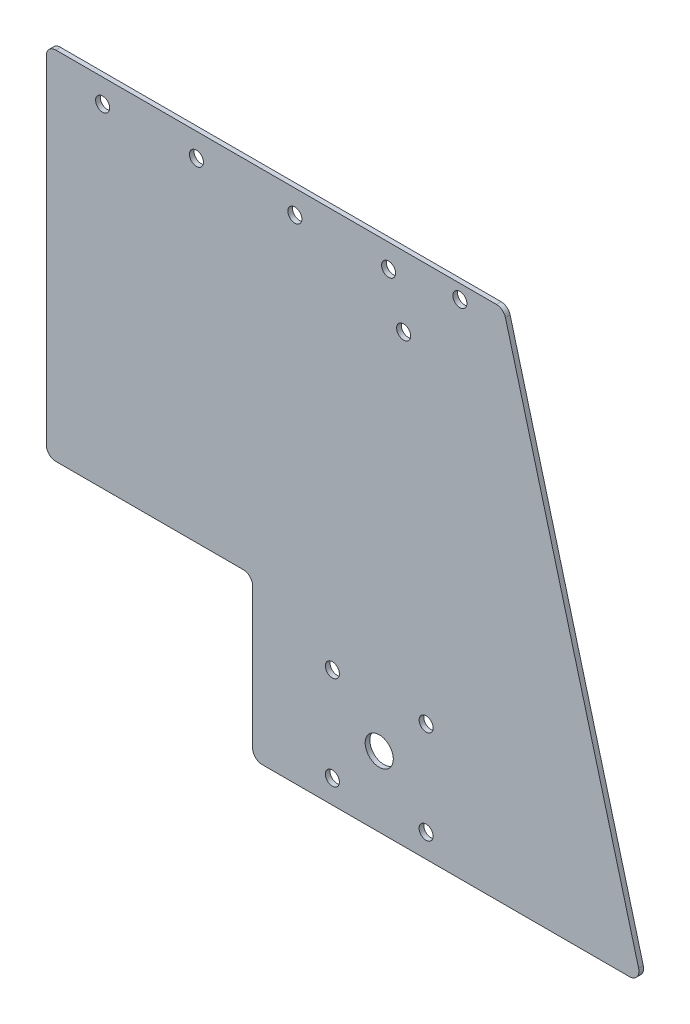
ISO-10303-21;
HEADER;
FILE_DESCRIPTION(('STEP AP214'),'2;1');
FILE_NAME('part.step','',(''),(''),'','','');
FILE_SCHEMA(('AUTOMOTIVE_DESIGN { 1 0 10303 214 1 1 1 1 }'));
ENDSEC;
DATA;
#1=APPLICATION_CONTEXT('core data for automotive mechanical design processes');
#2=APPLICATION_PROTOCOL_DEFINITION('international standard','automotive_design',2000,#1);
#3=PRODUCT_CONTEXT('',#1,'mechanical');
#4=PRODUCT('Part','Part','',(#3));
#5=PRODUCT_RELATED_PRODUCT_CATEGORY('part','',(#4));
#6=PRODUCT_DEFINITION_FORMATION('','',#4);
#7=PRODUCT_DEFINITION_CONTEXT('part definition',#1,'design');
#8=PRODUCT_DEFINITION('design','',#6,#7);
#9=PRODUCT_DEFINITION_SHAPE('','',#8);
#10=(LENGTH_UNIT() NAMED_UNIT(*) SI_UNIT(.MILLI.,.METRE.));
#11=(NAMED_UNIT(*) PLANE_ANGLE_UNIT() SI_UNIT($,.RADIAN.));
#12=(NAMED_UNIT(*) SI_UNIT($,.STERADIAN.) SOLID_ANGLE_UNIT());
#13=UNCERTAINTY_MEASURE_WITH_UNIT(LENGTH_MEASURE(1.E-05),#10,'distance_accuracy_value','');
#14=(GEOMETRIC_REPRESENTATION_CONTEXT(3) GLOBAL_UNCERTAINTY_ASSIGNED_CONTEXT((#13)) GLOBAL_UNIT_ASSIGNED_CONTEXT((#10,
#11,#12)) REPRESENTATION_CONTEXT('',''));
#15=CARTESIAN_POINT('',(0.,0.,0.));
#16=DIRECTION('',(0.,0.,1.));
#17=DIRECTION('',(1.,0.,0.));
#18=AXIS2_PLACEMENT_3D('',#15,#16,#17);
#19=CARTESIAN_POINT('',(0.,0.,1.));
#20=DIRECTION('',(0.,0.,1.));
#21=DIRECTION('',(1.,0.,0.));
#22=AXIS2_PLACEMENT_3D('',#19,#20,#21);
#23=PLANE('',#22);
#24=DIRECTION('',(0.,1.,0.));
#25=VECTOR('',#24,1.);
#26=CARTESIAN_POINT('',(48.,0.,1.));
#27=LINE('',#26,#25);
#28=CARTESIAN_POINT('',(48.,36.,1.));
#29=VERTEX_POINT('',#28);
#30=CARTESIAN_POINT('',(48.,108.,1.));
#31=VERTEX_POINT('',#30);
#32=EDGE_CURVE('E265',#29,#31,#27,.T.);
#33=ORIENTED_EDGE('',*,*,#32,.F.);
#34=CARTESIAN_POINT('',(50.,36.,1.));
#35=DIRECTION('',(0.,0.,1.));
#36=DIRECTION('',(1.,0.,0.));
#37=AXIS2_PLACEMENT_3D('',#34,#35,#36);
#38=CIRCLE('',#37,2.);
#39=CARTESIAN_POINT('',(50.,34.,1.));
#40=VERTEX_POINT('',#39);
#41=EDGE_CURVE('E51',#29,#40,#38,.T.);
#42=ORIENTED_EDGE('',*,*,#41,.T.);
#43=DIRECTION('',(-1.,0.,0.));
#44=VECTOR('',#43,1.);
#45=CARTESIAN_POINT('',(0.,34.,1.));
#46=LINE('',#45,#44);
#47=CARTESIAN_POINT('',(90.,34.,1.));
#48=VERTEX_POINT('',#47);
#49=EDGE_CURVE('E149',#48,#40,#46,.T.);
#50=ORIENTED_EDGE('',*,*,#49,.F.);
#51=CARTESIAN_POINT('',(90.,32.,1.));
#52=DIRECTION('',(0.,0.,1.));
#53=DIRECTION('',(1.,0.,0.));
#54=AXIS2_PLACEMENT_3D('',#51,#52,#53);
#55=CIRCLE('',#54,2.);
#56=CARTESIAN_POINT('',(92.,32.,1.));
#57=VERTEX_POINT('',#56);
#58=EDGE_CURVE('E132',#48,#57,#55,.F.);
#59=ORIENTED_EDGE('',*,*,#58,.T.);
#60=DIRECTION('',(0.,1.,0.));
#61=VECTOR('',#60,1.);
#62=CARTESIAN_POINT('',(92.,0.,1.));
#63=LINE('',#62,#61);
#64=CARTESIAN_POINT('',(92.,2.,1.));
#65=VERTEX_POINT('',#64);
#66=EDGE_CURVE('E163',#65,#57,#63,.T.);
#67=ORIENTED_EDGE('',*,*,#66,.F.);
#68=CARTESIAN_POINT('',(94.,2.,1.));
#69=DIRECTION('',(0.,0.,1.));
#70=DIRECTION('',(1.,0.,0.));
#71=AXIS2_PLACEMENT_3D('',#68,#69,#70);
#72=CIRCLE('',#71,2.);
#73=CARTESIAN_POINT('',(94.,0.,1.));
#74=VERTEX_POINT('',#73);
#75=EDGE_CURVE('E218',#65,#74,#72,.T.);
#76=ORIENTED_EDGE('',*,*,#75,.T.);
#77=DIRECTION('',(1.,0.,0.));
#78=VECTOR('',#77,1.);
#79=CARTESIAN_POINT('',(0.,0.,1.));
#80=LINE('',#79,#78);
#81=CARTESIAN_POINT('',(172.393549254318,0.,1.));
#82=VERTEX_POINT('',#81);
#83=EDGE_CURVE('E209',#74,#82,#80,.T.);
#84=ORIENTED_EDGE('',*,*,#83,.T.);
#85=CARTESIAN_POINT('',(172.393549254318,2.,1.));
#86=DIRECTION('',(0.,0.,1.));
#87=DIRECTION('',(1.,0.,0.));
#88=AXIS2_PLACEMENT_3D('',#85,#86,#87);
#89=CIRCLE('',#88,2.);
#90=CARTESIAN_POINT('',(174.325400906896,2.51763809020506,1.));
#91=VERTEX_POINT('',#90);
#92=EDGE_CURVE('E227',#82,#91,#89,.T.);
#93=ORIENTED_EDGE('',*,*,#92,.T.);
#94=DIRECTION('',(-0.258819045102525,0.965925826289067,0.));
#95=VECTOR('',#94,1.);
#96=CARTESIAN_POINT('',(175.,0.,1.));
#97=LINE('',#96,#95);
#98=CARTESIAN_POINT('',(145.922786509196,108.517638090205,1.));
#99=VERTEX_POINT('',#98);
#100=EDGE_CURVE('E212',#91,#99,#97,.T.);
#101=ORIENTED_EDGE('',*,*,#100,.T.);
#102=CARTESIAN_POINT('',(143.990934856618,108.,1.));
#103=DIRECTION('',(0.,0.,1.));
#104=DIRECTION('',(1.,0.,0.));
#105=AXIS2_PLACEMENT_3D('',#102,#103,#104);
#106=CIRCLE('',#105,2.);
#107=CARTESIAN_POINT('',(143.990934856618,110.,1.));
#108=VERTEX_POINT('',#107);
#109=EDGE_CURVE('E154',#99,#108,#106,.T.);
#110=ORIENTED_EDGE('',*,*,#109,.T.);
#111=DIRECTION('',(-1.,0.,0.));
#112=VECTOR('',#111,1.);
#113=CARTESIAN_POINT('',(145.525588832576,110.,1.));
#114=LINE('',#113,#112);
#115=CARTESIAN_POINT('',(50.,110.,1.));
#116=VERTEX_POINT('',#115);
#117=EDGE_CURVE('E216',#108,#116,#114,.T.);
#118=ORIENTED_EDGE('',*,*,#117,.T.);
#119=CARTESIAN_POINT('',(50.,108.,1.));
#120=DIRECTION('',(0.,0.,1.));
#121=DIRECTION('',(1.,0.,0.));
#122=AXIS2_PLACEMENT_3D('',#119,#120,#121);
#123=CIRCLE('',#122,2.);
#124=EDGE_CURVE('E58',#116,#31,#123,.T.);
#125=ORIENTED_EDGE('',*,*,#124,.T.);
#126=EDGE_LOOP('',(#33,#42,#50,#59,#67,#76,#84,#93,#101,#110,#118,#125));
#127=FACE_BOUND('',#126,.T.);
#128=CARTESIAN_POINT('',(121.,105.,1.));
#129=DIRECTION('',(0.,0.,1.));
#130=DIRECTION('',(1.,0.,0.));
#131=AXIS2_PLACEMENT_3D('',#128,#129,#130);
#132=CIRCLE('',#131,1.5);
#133=CARTESIAN_POINT('',(122.5,105.,1.));
#134=VERTEX_POINT('',#133);
#135=EDGE_CURVE('E311',#134,#134,#132,.T.);
#136=ORIENTED_EDGE('',*,*,#135,.F.);
#137=EDGE_LOOP('',(#136));
#138=FACE_BOUND('',#137,.T.);
#139=CARTESIAN_POINT('',(101.,105.,1.));
#140=DIRECTION('',(0.,0.,1.));
#141=DIRECTION('',(1.,0.,0.));
#142=AXIS2_PLACEMENT_3D('',#139,#140,#141);
#143=CIRCLE('',#142,1.5);
#144=CARTESIAN_POINT('',(102.5,105.,1.));
#145=VERTEX_POINT('',#144);
#146=EDGE_CURVE('E314',#145,#145,#143,.T.);
#147=ORIENTED_EDGE('',*,*,#146,.F.);
#148=EDGE_LOOP('',(#147));
#149=FACE_BOUND('',#148,.T.);
#150=CARTESIAN_POINT('',(80.,105.,1.));
#151=DIRECTION('',(0.,0.,1.));
#152=DIRECTION('',(1.,0.,0.));
#153=AXIS2_PLACEMENT_3D('',#150,#151,#152);
#154=CIRCLE('',#153,1.5);
#155=CARTESIAN_POINT('',(81.5,105.,1.));
#156=VERTEX_POINT('',#155);
#157=EDGE_CURVE('E320',#156,#156,#154,.T.);
#158=ORIENTED_EDGE('',*,*,#157,.F.);
#159=EDGE_LOOP('',(#158));
#160=FACE_BOUND('',#159,.T.);
#161=CARTESIAN_POINT('',(60.,105.,1.));
#162=DIRECTION('',(0.,0.,1.));
#163=DIRECTION('',(1.,0.,0.));
#164=AXIS2_PLACEMENT_3D('',#161,#162,#163);
#165=CIRCLE('',#164,1.5);
#166=CARTESIAN_POINT('',(61.5,105.,1.));
#167=VERTEX_POINT('',#166);
#168=EDGE_CURVE('E326',#167,#167,#165,.T.);
#169=ORIENTED_EDGE('',*,*,#168,.F.);
#170=EDGE_LOOP('',(#169));
#171=FACE_BOUND('',#170,.T.);
#172=CARTESIAN_POINT('',(136.2,107.,0.999999999999999));
#173=DIRECTION('',(0.,0.,1.));
#174=DIRECTION('',(1.,0.,0.));
#175=AXIS2_PLACEMENT_3D('',#172,#173,#174);
#176=CIRCLE('',#175,1.5);
#177=CARTESIAN_POINT('',(137.7,107.,0.999999999999999));
#178=VERTEX_POINT('',#177);
#179=EDGE_CURVE('E175',#178,#178,#176,.T.);
#180=ORIENTED_EDGE('',*,*,#179,.F.);
#181=EDGE_LOOP('',(#180));
#182=FACE_BOUND('',#181,.T.);
#183=CARTESIAN_POINT('',(124.2,95.,0.999999999999999));
#184=DIRECTION('',(0.,0.,1.));
#185=DIRECTION('',(1.,0.,0.));
#186=AXIS2_PLACEMENT_3D('',#183,#184,#185);
#187=CIRCLE('',#186,1.5);
#188=CARTESIAN_POINT('',(125.7,95.,0.999999999999999));
#189=VERTEX_POINT('',#188);
#190=EDGE_CURVE('E170',#189,#189,#187,.T.);
#191=ORIENTED_EDGE('',*,*,#190,.F.);
#192=EDGE_LOOP('',(#191));
#193=FACE_BOUND('',#192,.T.);
#194=CARTESIAN_POINT('',(109.,5.00000000000001,1.));
#195=DIRECTION('',(0.,0.,1.));
#196=DIRECTION('',(1.,0.,0.));
#197=AXIS2_PLACEMENT_3D('',#194,#195,#196);
#198=CIRCLE('',#197,1.5);
#199=CARTESIAN_POINT('',(110.5,5.00000000000001,1.));
#200=VERTEX_POINT('',#199);
#201=EDGE_CURVE('E185',#200,#200,#198,.T.);
#202=ORIENTED_EDGE('',*,*,#201,.F.);
#203=EDGE_LOOP('',(#202));
#204=FACE_BOUND('',#203,.T.);
#205=CARTESIAN_POINT('',(129.,5.00000000000001,1.));
#206=DIRECTION('',(0.,0.,1.));
#207=DIRECTION('',(1.,0.,0.));
#208=AXIS2_PLACEMENT_3D('',#205,#206,#207);
#209=CIRCLE('',#208,1.5);
#210=CARTESIAN_POINT('',(130.5,5.00000000000001,1.));
#211=VERTEX_POINT('',#210);
#212=EDGE_CURVE('E197',#211,#211,#209,.T.);
#213=ORIENTED_EDGE('',*,*,#212,.F.);
#214=EDGE_LOOP('',(#213));
#215=FACE_BOUND('',#214,.T.);
#216=CARTESIAN_POINT('',(129.,25.,1.));
#217=DIRECTION('',(0.,0.,1.));
#218=DIRECTION('',(1.,0.,0.));
#219=AXIS2_PLACEMENT_3D('',#216,#217,#218);
#220=CIRCLE('',#219,1.5);
#221=CARTESIAN_POINT('',(130.5,25.,1.));
#222=VERTEX_POINT('',#221);
#223=EDGE_CURVE('E203',#222,#222,#220,.T.);
#224=ORIENTED_EDGE('',*,*,#223,.F.);
#225=EDGE_LOOP('',(#224));
#226=FACE_BOUND('',#225,.T.);
#227=CARTESIAN_POINT('',(119.,15.,1.));
#228=DIRECTION('',(0.,0.,1.));
#229=DIRECTION('',(1.,0.,0.));
#230=AXIS2_PLACEMENT_3D('',#227,#228,#229);
#231=CIRCLE('',#230,3.00000000000001);
#232=CARTESIAN_POINT('',(122.,15.,1.));
#233=VERTEX_POINT('',#232);
#234=EDGE_CURVE('E191',#233,#233,#231,.T.);
#235=ORIENTED_EDGE('',*,*,#234,.F.);
#236=EDGE_LOOP('',(#235));
#237=FACE_BOUND('',#236,.T.);
#238=CARTESIAN_POINT('',(109.,25.,1.));
#239=DIRECTION('',(0.,0.,1.));
#240=DIRECTION('',(1.,0.,0.));
#241=AXIS2_PLACEMENT_3D('',#238,#239,#240);
#242=CIRCLE('',#241,1.5);
#243=CARTESIAN_POINT('',(110.5,25.,1.));
#244=VERTEX_POINT('',#243);
#245=EDGE_CURVE('E179',#244,#244,#242,.T.);
#246=ORIENTED_EDGE('',*,*,#245,.F.);
#247=EDGE_LOOP('',(#246));
#248=FACE_BOUND('',#247,.T.);
#249=ADVANCED_FACE('F43',(#127,#138,#149,#160,#171,#182,#193,#204,#215,#226,#237,#248),#23,.T.);
#250=CARTESIAN_POINT('',(0.,0.,0.));
#251=DIRECTION('',(0.,0.,1.));
#252=DIRECTION('',(1.,0.,0.));
#253=AXIS2_PLACEMENT_3D('',#250,#251,#252);
#254=PLANE('',#253);
#255=CARTESIAN_POINT('',(121.,105.,0.));
#256=DIRECTION('',(0.,0.,1.));
#257=DIRECTION('',(1.,0.,0.));
#258=AXIS2_PLACEMENT_3D('',#255,#256,#257);
#259=CIRCLE('',#258,1.5);
#260=CARTESIAN_POINT('',(122.5,105.,0.));
#261=VERTEX_POINT('',#260);
#262=EDGE_CURVE('E308',#261,#261,#259,.T.);
#263=ORIENTED_EDGE('',*,*,#262,.T.);
#264=EDGE_LOOP('',(#263));
#265=FACE_BOUND('',#264,.T.);
#266=CARTESIAN_POINT('',(101.,105.,0.));
#267=DIRECTION('',(0.,0.,1.));
#268=DIRECTION('',(1.,0.,0.));
#269=AXIS2_PLACEMENT_3D('',#266,#267,#268);
#270=CIRCLE('',#269,1.5);
#271=CARTESIAN_POINT('',(102.5,105.,0.));
#272=VERTEX_POINT('',#271);
#273=EDGE_CURVE('E317',#272,#272,#270,.T.);
#274=ORIENTED_EDGE('',*,*,#273,.T.);
#275=EDGE_LOOP('',(#274));
#276=FACE_BOUND('',#275,.T.);
#277=CARTESIAN_POINT('',(80.,105.,0.));
#278=DIRECTION('',(0.,0.,1.));
#279=DIRECTION('',(1.,0.,0.));
#280=AXIS2_PLACEMENT_3D('',#277,#278,#279);
#281=CIRCLE('',#280,1.5);
#282=CARTESIAN_POINT('',(81.5,105.,0.));
#283=VERTEX_POINT('',#282);
#284=EDGE_CURVE('E323',#283,#283,#281,.T.);
#285=ORIENTED_EDGE('',*,*,#284,.T.);
#286=EDGE_LOOP('',(#285));
#287=FACE_BOUND('',#286,.T.);
#288=CARTESIAN_POINT('',(60.,105.,0.));
#289=DIRECTION('',(0.,0.,1.));
#290=DIRECTION('',(1.,0.,0.));
#291=AXIS2_PLACEMENT_3D('',#288,#289,#290);
#292=CIRCLE('',#291,1.5);
#293=CARTESIAN_POINT('',(61.5,105.,0.));
#294=VERTEX_POINT('',#293);
#295=EDGE_CURVE('E269',#294,#294,#292,.T.);
#296=ORIENTED_EDGE('',*,*,#295,.T.);
#297=EDGE_LOOP('',(#296));
#298=FACE_BOUND('',#297,.T.);
#299=CARTESIAN_POINT('',(136.2,107.,0.));
#300=DIRECTION('',(0.,0.,-1.));
#301=DIRECTION('',(-1.,0.,0.));
#302=AXIS2_PLACEMENT_3D('',#299,#300,#301);
#303=CIRCLE('',#302,1.5);
#304=CARTESIAN_POINT('',(134.7,107.,0.));
#305=VERTEX_POINT('',#304);
#306=EDGE_CURVE('E167',#305,#305,#303,.T.);
#307=ORIENTED_EDGE('',*,*,#306,.F.);
#308=EDGE_LOOP('',(#307));
#309=FACE_BOUND('',#308,.T.);
#310=CARTESIAN_POINT('',(124.2,95.,0.));
#311=DIRECTION('',(0.,0.,-1.));
#312=DIRECTION('',(-1.,0.,0.));
#313=AXIS2_PLACEMENT_3D('',#310,#311,#312);
#314=CIRCLE('',#313,1.5);
#315=CARTESIAN_POINT('',(122.7,95.,0.));
#316=VERTEX_POINT('',#315);
#317=EDGE_CURVE('E160',#316,#316,#314,.T.);
#318=ORIENTED_EDGE('',*,*,#317,.F.);
#319=EDGE_LOOP('',(#318));
#320=FACE_BOUND('',#319,.T.);
#321=DIRECTION('',(-1.,0.,0.));
#322=VECTOR('',#321,1.);
#323=CARTESIAN_POINT('',(0.,34.,0.));
#324=LINE('',#323,#322);
#325=CARTESIAN_POINT('',(90.,34.,0.));
#326=VERTEX_POINT('',#325);
#327=CARTESIAN_POINT('',(50.,34.,0.));
#328=VERTEX_POINT('',#327);
#329=EDGE_CURVE('E152',#326,#328,#324,.T.);
#330=ORIENTED_EDGE('',*,*,#329,.T.);
#331=CARTESIAN_POINT('',(50.,36.,0.));
#332=DIRECTION('',(0.,0.,1.));
#333=DIRECTION('',(1.,0.,0.));
#334=AXIS2_PLACEMENT_3D('',#331,#332,#333);
#335=CIRCLE('',#334,2.);
#336=CARTESIAN_POINT('',(48.,36.,0.));
#337=VERTEX_POINT('',#336);
#338=EDGE_CURVE('E255',#328,#337,#335,.F.);
#339=ORIENTED_EDGE('',*,*,#338,.T.);
#340=DIRECTION('',(0.,-1.,0.));
#341=VECTOR('',#340,1.);
#342=CARTESIAN_POINT('',(48.,120.,0.));
#343=LINE('',#342,#341);
#344=CARTESIAN_POINT('',(48.,108.,0.));
#345=VERTEX_POINT('',#344);
#346=EDGE_CURVE('E267',#345,#337,#343,.T.);
#347=ORIENTED_EDGE('',*,*,#346,.F.);
#348=CARTESIAN_POINT('',(50.,108.,0.));
#349=DIRECTION('',(0.,0.,1.));
#350=DIRECTION('',(1.,0.,0.));
#351=AXIS2_PLACEMENT_3D('',#348,#349,#350);
#352=CIRCLE('',#351,2.);
#353=CARTESIAN_POINT('',(50.,110.,0.));
#354=VERTEX_POINT('',#353);
#355=EDGE_CURVE('E253',#345,#354,#352,.F.);
#356=ORIENTED_EDGE('',*,*,#355,.T.);
#357=DIRECTION('',(-1.,0.,0.));
#358=VECTOR('',#357,1.);
#359=CARTESIAN_POINT('',(145.525588832576,110.,0.));
#360=LINE('',#359,#358);
#361=CARTESIAN_POINT('',(143.990934856618,110.,0.));
#362=VERTEX_POINT('',#361);
#363=EDGE_CURVE('E213',#362,#354,#360,.T.);
#364=ORIENTED_EDGE('',*,*,#363,.F.);
#365=CARTESIAN_POINT('',(143.990934856618,108.,0.));
#366=DIRECTION('',(0.,0.,1.));
#367=DIRECTION('',(1.,0.,0.));
#368=AXIS2_PLACEMENT_3D('',#365,#366,#367);
#369=CIRCLE('',#368,2.);
#370=CARTESIAN_POINT('',(145.922786509196,108.517638090205,0.));
#371=VERTEX_POINT('',#370);
#372=EDGE_CURVE('E233',#362,#371,#369,.F.);
#373=ORIENTED_EDGE('',*,*,#372,.T.);
#374=DIRECTION('',(-0.258819045102525,0.965925826289067,0.));
#375=VECTOR('',#374,1.);
#376=CARTESIAN_POINT('',(175.,0.,0.));
#377=LINE('',#376,#375);
#378=CARTESIAN_POINT('',(174.325400906896,2.51763809020506,0.));
#379=VERTEX_POINT('',#378);
#380=EDGE_CURVE('E221',#379,#371,#377,.T.);
#381=ORIENTED_EDGE('',*,*,#380,.F.);
#382=CARTESIAN_POINT('',(172.393549254318,2.,0.));
#383=DIRECTION('',(0.,0.,1.));
#384=DIRECTION('',(1.,0.,0.));
#385=AXIS2_PLACEMENT_3D('',#382,#383,#384);
#386=CIRCLE('',#385,2.);
#387=CARTESIAN_POINT('',(172.393549254318,0.,0.));
#388=VERTEX_POINT('',#387);
#389=EDGE_CURVE('E231',#379,#388,#386,.F.);
#390=ORIENTED_EDGE('',*,*,#389,.T.);
#391=DIRECTION('',(1.,0.,0.));
#392=VECTOR('',#391,1.);
#393=CARTESIAN_POINT('',(0.,0.,0.));
#394=LINE('',#393,#392);
#395=CARTESIAN_POINT('',(94.,0.,0.));
#396=VERTEX_POINT('',#395);
#397=EDGE_CURVE('E206',#396,#388,#394,.T.);
#398=ORIENTED_EDGE('',*,*,#397,.F.);
#399=CARTESIAN_POINT('',(94.,2.,0.));
#400=DIRECTION('',(0.,0.,1.));
#401=DIRECTION('',(1.,0.,0.));
#402=AXIS2_PLACEMENT_3D('',#399,#400,#401);
#403=CIRCLE('',#402,2.);
#404=CARTESIAN_POINT('',(92.,2.,0.));
#405=VERTEX_POINT('',#404);
#406=EDGE_CURVE('E153',#396,#405,#403,.F.);
#407=ORIENTED_EDGE('',*,*,#406,.T.);
#408=DIRECTION('',(0.,1.,0.));
#409=VECTOR('',#408,1.);
#410=CARTESIAN_POINT('',(92.,0.,0.));
#411=LINE('',#410,#409);
#412=CARTESIAN_POINT('',(92.,32.,0.));
#413=VERTEX_POINT('',#412);
#414=EDGE_CURVE('E158',#405,#413,#411,.T.);
#415=ORIENTED_EDGE('',*,*,#414,.T.);
#416=CARTESIAN_POINT('',(90.,32.,0.));
#417=DIRECTION('',(0.,0.,1.));
#418=DIRECTION('',(1.,0.,0.));
#419=AXIS2_PLACEMENT_3D('',#416,#417,#418);
#420=CIRCLE('',#419,2.);
#421=EDGE_CURVE('E141',#413,#326,#420,.T.);
#422=ORIENTED_EDGE('',*,*,#421,.T.);
#423=EDGE_LOOP('',(#330,#339,#347,#356,#364,#373,#381,#390,#398,#407,#415,#422));
#424=FACE_BOUND('',#423,.T.);
#425=CARTESIAN_POINT('',(129.,25.,0.));
#426=DIRECTION('',(0.,0.,1.));
#427=DIRECTION('',(1.,0.,0.));
#428=AXIS2_PLACEMENT_3D('',#425,#426,#427);
#429=CIRCLE('',#428,1.5);
#430=CARTESIAN_POINT('',(130.5,25.,0.));
#431=VERTEX_POINT('',#430);
#432=EDGE_CURVE('E200',#431,#431,#429,.T.);
#433=ORIENTED_EDGE('',*,*,#432,.T.);
#434=EDGE_LOOP('',(#433));
#435=FACE_BOUND('',#434,.T.);
#436=CARTESIAN_POINT('',(129.,5.00000000000001,0.));
#437=DIRECTION('',(0.,0.,1.));
#438=DIRECTION('',(1.,0.,0.));
#439=AXIS2_PLACEMENT_3D('',#436,#437,#438);
#440=CIRCLE('',#439,1.5);
#441=CARTESIAN_POINT('',(130.5,5.00000000000001,0.));
#442=VERTEX_POINT('',#441);
#443=EDGE_CURVE('E194',#442,#442,#440,.T.);
#444=ORIENTED_EDGE('',*,*,#443,.T.);
#445=EDGE_LOOP('',(#444));
#446=FACE_BOUND('',#445,.T.);
#447=CARTESIAN_POINT('',(119.,15.,0.));
#448=DIRECTION('',(0.,0.,1.));
#449=DIRECTION('',(1.,0.,0.));
#450=AXIS2_PLACEMENT_3D('',#447,#448,#449);
#451=CIRCLE('',#450,3.00000000000001);
#452=CARTESIAN_POINT('',(122.,15.,0.));
#453=VERTEX_POINT('',#452);
#454=EDGE_CURVE('E188',#453,#453,#451,.T.);
#455=ORIENTED_EDGE('',*,*,#454,.T.);
#456=EDGE_LOOP('',(#455));
#457=FACE_BOUND('',#456,.T.);
#458=CARTESIAN_POINT('',(109.,5.00000000000001,0.));
#459=DIRECTION('',(0.,0.,1.));
#460=DIRECTION('',(1.,0.,0.));
#461=AXIS2_PLACEMENT_3D('',#458,#459,#460);
#462=CIRCLE('',#461,1.5);
#463=CARTESIAN_POINT('',(110.5,5.00000000000001,0.));
#464=VERTEX_POINT('',#463);
#465=EDGE_CURVE('E182',#464,#464,#462,.T.);
#466=ORIENTED_EDGE('',*,*,#465,.T.);
#467=EDGE_LOOP('',(#466));
#468=FACE_BOUND('',#467,.T.);
#469=CARTESIAN_POINT('',(109.,25.,0.));
#470=DIRECTION('',(0.,0.,1.));
#471=DIRECTION('',(1.,0.,0.));
#472=AXIS2_PLACEMENT_3D('',#469,#470,#471);
#473=CIRCLE('',#472,1.5);
#474=CARTESIAN_POINT('',(110.5,25.,0.));
#475=VERTEX_POINT('',#474);
#476=EDGE_CURVE('E178',#475,#475,#473,.T.);
#477=ORIENTED_EDGE('',*,*,#476,.T.);
#478=EDGE_LOOP('',(#477));
#479=FACE_BOUND('',#478,.T.);
#480=ADVANCED_FACE('F273',(#265,#276,#287,#298,#309,#320,#424,#435,#446,#457,#468,#479),#254,.F.);
#481=CARTESIAN_POINT('',(0.,0.,1.));
#482=DIRECTION('',(0.,1.,0.));
#483=DIRECTION('',(0.,0.,1.));
#484=AXIS2_PLACEMENT_3D('',#481,#482,#483);
#485=PLANE('',#484);
#486=ORIENTED_EDGE('',*,*,#397,.T.);
#487=DIRECTION('',(0.,0.,-1.));
#488=VECTOR('',#487,1.);
#489=CARTESIAN_POINT('',(172.393549254318,0.,1.));
#490=LINE('',#489,#488);
#491=EDGE_CURVE('E245',#388,#82,#490,.F.);
#492=ORIENTED_EDGE('',*,*,#491,.T.);
#493=ORIENTED_EDGE('',*,*,#83,.F.);
#494=DIRECTION('',(0.,0.,1.));
#495=VECTOR('',#494,1.);
#496=CARTESIAN_POINT('',(94.,0.,1.));
#497=LINE('',#496,#495);
#498=EDGE_CURVE('E243',#74,#396,#497,.F.);
#499=ORIENTED_EDGE('',*,*,#498,.T.);
#500=EDGE_LOOP('',(#486,#492,#493,#499));
#501=FACE_BOUND('',#500,.T.);
#502=ADVANCED_FACE('F287',(#501),#485,.F.);
#503=CARTESIAN_POINT('',(175.,0.,1.));
#504=DIRECTION('',(-0.965925826289067,-0.258819045102525,0.));
#505=DIRECTION('',(0.258819045102525,-0.965925826289067,0.));
#506=AXIS2_PLACEMENT_3D('',#503,#504,#505);
#507=PLANE('',#506);
#508=ORIENTED_EDGE('',*,*,#380,.T.);
#509=DIRECTION('',(0.,0.,-1.));
#510=VECTOR('',#509,1.);
#511=CARTESIAN_POINT('',(145.922786509196,108.517638090205,1.));
#512=LINE('',#511,#510);
#513=EDGE_CURVE('E241',#371,#99,#512,.F.);
#514=ORIENTED_EDGE('',*,*,#513,.T.);
#515=ORIENTED_EDGE('',*,*,#100,.F.);
#516=DIRECTION('',(0.,0.,-1.));
#517=VECTOR('',#516,1.);
#518=CARTESIAN_POINT('',(174.325400906896,2.51763809020506,1.));
#519=LINE('',#518,#517);
#520=EDGE_CURVE('E238',#91,#379,#519,.T.);
#521=ORIENTED_EDGE('',*,*,#520,.T.);
#522=EDGE_LOOP('',(#508,#514,#515,#521));
#523=FACE_BOUND('',#522,.T.);
#524=ADVANCED_FACE('F295',(#523),#507,.F.);
#525=CARTESIAN_POINT('',(145.525588832576,110.,1.));
#526=DIRECTION('',(0.,-1.,0.));
#527=DIRECTION('',(1.,0.,0.));
#528=AXIS2_PLACEMENT_3D('',#525,#526,#527);
#529=PLANE('',#528);
#530=ORIENTED_EDGE('',*,*,#363,.T.);
#531=DIRECTION('',(0.,0.,1.));
#532=VECTOR('',#531,1.);
#533=CARTESIAN_POINT('',(50.,110.,1.));
#534=LINE('',#533,#532);
#535=EDGE_CURVE('E11',#354,#116,#534,.T.);
#536=ORIENTED_EDGE('',*,*,#535,.T.);
#537=ORIENTED_EDGE('',*,*,#117,.F.);
#538=DIRECTION('',(0.,0.,-1.));
#539=VECTOR('',#538,1.);
#540=CARTESIAN_POINT('',(143.990934856618,110.,1.));
#541=LINE('',#540,#539);
#542=EDGE_CURVE('E235',#108,#362,#541,.T.);
#543=ORIENTED_EDGE('',*,*,#542,.T.);
#544=EDGE_LOOP('',(#530,#536,#537,#543));
#545=FACE_BOUND('',#544,.T.);
#546=ADVANCED_FACE('F303',(#545),#529,.F.);
#547=CARTESIAN_POINT('',(129.,25.,1.));
#548=DIRECTION('',(0.,0.,-1.));
#549=DIRECTION('',(-1.,0.,0.));
#550=AXIS2_PLACEMENT_3D('',#547,#548,#549);
#551=CYLINDRICAL_SURFACE('',#550,1.5);
#552=ORIENTED_EDGE('',*,*,#223,.T.);
#553=EDGE_LOOP('',(#552));
#554=FACE_BOUND('',#553,.T.);
#555=ORIENTED_EDGE('',*,*,#432,.F.);
#556=EDGE_LOOP('',(#555));
#557=FACE_BOUND('',#556,.T.);
#558=ADVANCED_FACE('F378',(#554,#557),#551,.F.);
#559=CARTESIAN_POINT('',(129.,5.00000000000001,1.));
#560=DIRECTION('',(0.,0.,-1.));
#561=DIRECTION('',(-1.,0.,0.));
#562=AXIS2_PLACEMENT_3D('',#559,#560,#561);
#563=CYLINDRICAL_SURFACE('',#562,1.5);
#564=ORIENTED_EDGE('',*,*,#212,.T.);
#565=EDGE_LOOP('',(#564));
#566=FACE_BOUND('',#565,.T.);
#567=ORIENTED_EDGE('',*,*,#443,.F.);
#568=EDGE_LOOP('',(#567));
#569=FACE_BOUND('',#568,.T.);
#570=ADVANCED_FACE('F425',(#566,#569),#563,.F.);
#571=CARTESIAN_POINT('',(119.,15.,1.));
#572=DIRECTION('',(0.,0.,-1.));
#573=DIRECTION('',(-1.,0.,0.));
#574=AXIS2_PLACEMENT_3D('',#571,#572,#573);
#575=CYLINDRICAL_SURFACE('',#574,3.00000000000001);
#576=ORIENTED_EDGE('',*,*,#234,.T.);
#577=EDGE_LOOP('',(#576));
#578=FACE_BOUND('',#577,.T.);
#579=ORIENTED_EDGE('',*,*,#454,.F.);
#580=EDGE_LOOP('',(#579));
#581=FACE_BOUND('',#580,.T.);
#582=ADVANCED_FACE('F421',(#578,#581),#575,.F.);
#583=CARTESIAN_POINT('',(109.,5.00000000000001,1.));
#584=DIRECTION('',(0.,0.,-1.));
#585=DIRECTION('',(-1.,0.,0.));
#586=AXIS2_PLACEMENT_3D('',#583,#584,#585);
#587=CYLINDRICAL_SURFACE('',#586,1.5);
#588=ORIENTED_EDGE('',*,*,#201,.T.);
#589=EDGE_LOOP('',(#588));
#590=FACE_BOUND('',#589,.T.);
#591=ORIENTED_EDGE('',*,*,#465,.F.);
#592=EDGE_LOOP('',(#591));
#593=FACE_BOUND('',#592,.T.);
#594=ADVANCED_FACE('F362',(#590,#593),#587,.F.);
#595=CARTESIAN_POINT('',(109.,25.,1.));
#596=DIRECTION('',(0.,0.,-1.));
#597=DIRECTION('',(-1.,0.,0.));
#598=AXIS2_PLACEMENT_3D('',#595,#596,#597);
#599=CYLINDRICAL_SURFACE('',#598,1.5);
#600=ORIENTED_EDGE('',*,*,#245,.T.);
#601=EDGE_LOOP('',(#600));
#602=FACE_BOUND('',#601,.T.);
#603=ORIENTED_EDGE('',*,*,#476,.F.);
#604=EDGE_LOOP('',(#603));
#605=FACE_BOUND('',#604,.T.);
#606=ADVANCED_FACE('F358',(#602,#605),#599,.F.);
#607=CARTESIAN_POINT('',(124.2,95.,10.));
#608=DIRECTION('',(0.,0.,-1.));
#609=DIRECTION('',(-1.,0.,0.));
#610=AXIS2_PLACEMENT_3D('',#607,#608,#609);
#611=CYLINDRICAL_SURFACE('',#610,1.5);
#612=ORIENTED_EDGE('',*,*,#190,.T.);
#613=EDGE_LOOP('',(#612));
#614=FACE_BOUND('',#613,.T.);
#615=ORIENTED_EDGE('',*,*,#317,.T.);
#616=EDGE_LOOP('',(#615));
#617=FACE_BOUND('',#616,.T.);
#618=ADVANCED_FACE('F361',(#614,#617),#611,.F.);
#619=CARTESIAN_POINT('',(136.2,107.,10.));
#620=DIRECTION('',(0.,0.,-1.));
#621=DIRECTION('',(-1.,0.,0.));
#622=AXIS2_PLACEMENT_3D('',#619,#620,#621);
#623=CYLINDRICAL_SURFACE('',#622,1.5);
#624=ORIENTED_EDGE('',*,*,#179,.T.);
#625=EDGE_LOOP('',(#624));
#626=FACE_BOUND('',#625,.T.);
#627=ORIENTED_EDGE('',*,*,#306,.T.);
#628=EDGE_LOOP('',(#627));
#629=FACE_BOUND('',#628,.T.);
#630=ADVANCED_FACE('F412',(#626,#629),#623,.F.);
#631=CARTESIAN_POINT('',(0.,34.,-9.));
#632=DIRECTION('',(0.,1.,0.));
#633=DIRECTION('',(0.,0.,1.));
#634=AXIS2_PLACEMENT_3D('',#631,#632,#633);
#635=PLANE('',#634);
#636=ORIENTED_EDGE('',*,*,#49,.T.);
#637=DIRECTION('',(0.,0.,-1.));
#638=VECTOR('',#637,1.);
#639=CARTESIAN_POINT('',(50.,34.,-9.));
#640=LINE('',#639,#638);
#641=EDGE_CURVE('E251',#40,#328,#640,.T.);
#642=ORIENTED_EDGE('',*,*,#641,.T.);
#643=ORIENTED_EDGE('',*,*,#329,.F.);
#644=DIRECTION('',(0.,0.,1.));
#645=VECTOR('',#644,1.);
#646=CARTESIAN_POINT('',(90.,34.,1.));
#647=LINE('',#646,#645);
#648=EDGE_CURVE('E136',#326,#48,#647,.T.);
#649=ORIENTED_EDGE('',*,*,#648,.T.);
#650=EDGE_LOOP('',(#636,#642,#643,#649));
#651=FACE_BOUND('',#650,.T.);
#652=ADVANCED_FACE('F147',(#651),#635,.F.);
#653=CARTESIAN_POINT('',(92.,0.,-9.));
#654=DIRECTION('',(1.,0.,0.));
#655=DIRECTION('',(0.,0.,-1.));
#656=AXIS2_PLACEMENT_3D('',#653,#654,#655);
#657=PLANE('',#656);
#658=ORIENTED_EDGE('',*,*,#414,.F.);
#659=DIRECTION('',(0.,0.,1.));
#660=VECTOR('',#659,1.);
#661=CARTESIAN_POINT('',(92.,2.,-9.));
#662=LINE('',#661,#660);
#663=EDGE_CURVE('E142',#405,#65,#662,.T.);
#664=ORIENTED_EDGE('',*,*,#663,.T.);
#665=ORIENTED_EDGE('',*,*,#66,.T.);
#666=DIRECTION('',(0.,0.,1.));
#667=VECTOR('',#666,1.);
#668=CARTESIAN_POINT('',(92.,32.,0.));
#669=LINE('',#668,#667);
#670=EDGE_CURVE('E137',#57,#413,#669,.F.);
#671=ORIENTED_EDGE('',*,*,#670,.T.);
#672=EDGE_LOOP('',(#658,#664,#665,#671));
#673=FACE_BOUND('',#672,.T.);
#674=ADVANCED_FACE('F280',(#673),#657,.F.);
#675=CARTESIAN_POINT('',(60.,105.,0.));
#676=DIRECTION('',(0.,0.,1.));
#677=DIRECTION('',(1.,0.,0.));
#678=AXIS2_PLACEMENT_3D('',#675,#676,#677);
#679=CYLINDRICAL_SURFACE('',#678,1.5);
#680=ORIENTED_EDGE('',*,*,#295,.F.);
#681=EDGE_LOOP('',(#680));
#682=FACE_BOUND('',#681,.T.);
#683=ORIENTED_EDGE('',*,*,#168,.T.);
#684=EDGE_LOOP('',(#683));
#685=FACE_BOUND('',#684,.T.);
#686=ADVANCED_FACE('F334',(#682,#685),#679,.F.);
#687=CARTESIAN_POINT('',(80.,105.,0.));
#688=DIRECTION('',(0.,0.,1.));
#689=DIRECTION('',(1.,0.,0.));
#690=AXIS2_PLACEMENT_3D('',#687,#688,#689);
#691=CYLINDRICAL_SURFACE('',#690,1.5);
#692=ORIENTED_EDGE('',*,*,#284,.F.);
#693=EDGE_LOOP('',(#692));
#694=FACE_BOUND('',#693,.T.);
#695=ORIENTED_EDGE('',*,*,#157,.T.);
#696=EDGE_LOOP('',(#695));
#697=FACE_BOUND('',#696,.T.);
#698=ADVANCED_FACE('F337',(#694,#697),#691,.F.);
#699=CARTESIAN_POINT('',(101.,105.,0.));
#700=DIRECTION('',(0.,0.,1.));
#701=DIRECTION('',(1.,0.,0.));
#702=AXIS2_PLACEMENT_3D('',#699,#700,#701);
#703=CYLINDRICAL_SURFACE('',#702,1.5);
#704=ORIENTED_EDGE('',*,*,#273,.F.);
#705=EDGE_LOOP('',(#704));
#706=FACE_BOUND('',#705,.T.);
#707=ORIENTED_EDGE('',*,*,#146,.T.);
#708=EDGE_LOOP('',(#707));
#709=FACE_BOUND('',#708,.T.);
#710=ADVANCED_FACE('F400',(#706,#709),#703,.F.);
#711=CARTESIAN_POINT('',(121.,105.,0.));
#712=DIRECTION('',(0.,0.,1.));
#713=DIRECTION('',(1.,0.,0.));
#714=AXIS2_PLACEMENT_3D('',#711,#712,#713);
#715=CYLINDRICAL_SURFACE('',#714,1.5);
#716=ORIENTED_EDGE('',*,*,#262,.F.);
#717=EDGE_LOOP('',(#716));
#718=FACE_BOUND('',#717,.T.);
#719=ORIENTED_EDGE('',*,*,#135,.T.);
#720=EDGE_LOOP('',(#719));
#721=FACE_BOUND('',#720,.T.);
#722=ADVANCED_FACE('F383',(#718,#721),#715,.F.);
#723=CARTESIAN_POINT('',(143.990934856618,108.,1.));
#724=DIRECTION('',(0.,0.,-1.));
#725=DIRECTION('',(-1.,0.,0.));
#726=AXIS2_PLACEMENT_3D('',#723,#724,#725);
#727=CYLINDRICAL_SURFACE('',#726,2.);
#728=ORIENTED_EDGE('',*,*,#109,.F.);
#729=ORIENTED_EDGE('',*,*,#513,.F.);
#730=ORIENTED_EDGE('',*,*,#372,.F.);
#731=ORIENTED_EDGE('',*,*,#542,.F.);
#732=EDGE_LOOP('',(#728,#729,#730,#731));
#733=FACE_BOUND('',#732,.T.);
#734=ADVANCED_FACE('F299',(#733),#727,.T.);
#735=CARTESIAN_POINT('',(172.393549254318,2.,1.));
#736=DIRECTION('',(0.,0.,-1.));
#737=DIRECTION('',(-1.,0.,0.));
#738=AXIS2_PLACEMENT_3D('',#735,#736,#737);
#739=CYLINDRICAL_SURFACE('',#738,2.);
#740=ORIENTED_EDGE('',*,*,#92,.F.);
#741=ORIENTED_EDGE('',*,*,#491,.F.);
#742=ORIENTED_EDGE('',*,*,#389,.F.);
#743=ORIENTED_EDGE('',*,*,#520,.F.);
#744=EDGE_LOOP('',(#740,#741,#742,#743));
#745=FACE_BOUND('',#744,.T.);
#746=ADVANCED_FACE('F290',(#745),#739,.T.);
#747=CARTESIAN_POINT('',(94.,2.,-9.));
#748=DIRECTION('',(0.,0.,1.));
#749=DIRECTION('',(1.,0.,0.));
#750=AXIS2_PLACEMENT_3D('',#747,#748,#749);
#751=CYLINDRICAL_SURFACE('',#750,2.);
#752=ORIENTED_EDGE('',*,*,#406,.F.);
#753=ORIENTED_EDGE('',*,*,#498,.F.);
#754=ORIENTED_EDGE('',*,*,#75,.F.);
#755=ORIENTED_EDGE('',*,*,#663,.F.);
#756=EDGE_LOOP('',(#752,#753,#754,#755));
#757=FACE_BOUND('',#756,.T.);
#758=ADVANCED_FACE('F282',(#757),#751,.T.);
#759=CARTESIAN_POINT('',(90.,32.,-9.));
#760=DIRECTION('',(0.,0.,-1.));
#761=DIRECTION('',(-1.,0.,0.));
#762=AXIS2_PLACEMENT_3D('',#759,#760,#761);
#763=CYLINDRICAL_SURFACE('',#762,2.);
#764=ORIENTED_EDGE('',*,*,#421,.F.);
#765=ORIENTED_EDGE('',*,*,#670,.F.);
#766=ORIENTED_EDGE('',*,*,#58,.F.);
#767=ORIENTED_EDGE('',*,*,#648,.F.);
#768=EDGE_LOOP('',(#764,#765,#766,#767));
#769=FACE_BOUND('',#768,.T.);
#770=ADVANCED_FACE('F135',(#769),#763,.F.);
#771=CARTESIAN_POINT('',(48.,120.,10.));
#772=DIRECTION('',(1.,0.,0.));
#773=DIRECTION('',(0.,1.,0.));
#774=AXIS2_PLACEMENT_3D('',#771,#772,#773);
#775=PLANE('',#774);
#776=ORIENTED_EDGE('',*,*,#346,.T.);
#777=DIRECTION('',(0.,0.,-1.));
#778=VECTOR('',#777,1.);
#779=CARTESIAN_POINT('',(48.,36.,10.));
#780=LINE('',#779,#778);
#781=EDGE_CURVE('E259',#337,#29,#780,.F.);
#782=ORIENTED_EDGE('',*,*,#781,.T.);
#783=ORIENTED_EDGE('',*,*,#32,.T.);
#784=DIRECTION('',(0.,0.,1.));
#785=VECTOR('',#784,1.);
#786=CARTESIAN_POINT('',(48.,108.,10.));
#787=LINE('',#786,#785);
#788=EDGE_CURVE('E257',#31,#345,#787,.F.);
#789=ORIENTED_EDGE('',*,*,#788,.T.);
#790=EDGE_LOOP('',(#776,#782,#783,#789));
#791=FACE_BOUND('',#790,.T.);
#792=ADVANCED_FACE('F264',(#791),#775,.F.);
#793=CARTESIAN_POINT('',(50.,36.,-9.));
#794=DIRECTION('',(0.,0.,-1.));
#795=DIRECTION('',(-1.,0.,0.));
#796=AXIS2_PLACEMENT_3D('',#793,#794,#795);
#797=CYLINDRICAL_SURFACE('',#796,2.);
#798=ORIENTED_EDGE('',*,*,#41,.F.);
#799=ORIENTED_EDGE('',*,*,#781,.F.);
#800=ORIENTED_EDGE('',*,*,#338,.F.);
#801=ORIENTED_EDGE('',*,*,#641,.F.);
#802=EDGE_LOOP('',(#798,#799,#800,#801));
#803=FACE_BOUND('',#802,.T.);
#804=ADVANCED_FACE('F271',(#803),#797,.T.);
#805=CARTESIAN_POINT('',(50.,108.,1.));
#806=DIRECTION('',(0.,0.,1.));
#807=DIRECTION('',(1.,0.,0.));
#808=AXIS2_PLACEMENT_3D('',#805,#806,#807);
#809=CYLINDRICAL_SURFACE('',#808,2.);
#810=ORIENTED_EDGE('',*,*,#355,.F.);
#811=ORIENTED_EDGE('',*,*,#788,.F.);
#812=ORIENTED_EDGE('',*,*,#124,.F.);
#813=ORIENTED_EDGE('',*,*,#535,.F.);
#814=EDGE_LOOP('',(#810,#811,#812,#813));
#815=FACE_BOUND('',#814,.T.);
#816=ADVANCED_FACE('F45',(#815),#809,.T.);
#817=CLOSED_SHELL('',(#249,#480,#502,#524,#546,#558,#570,#582,#594,#606,#618,#630,#652,#674,
#686,#698,#710,#722,#734,#746,#758,#770,#792,#804,#816));
#818=MANIFOLD_SOLID_BREP('B2',#817);
#819=ADVANCED_BREP_SHAPE_REPRESENTATION('',(#18,#818),#14);
#820=SHAPE_DEFINITION_REPRESENTATION(#9,#819);
ENDSEC;
END-ISO-10303-21;
